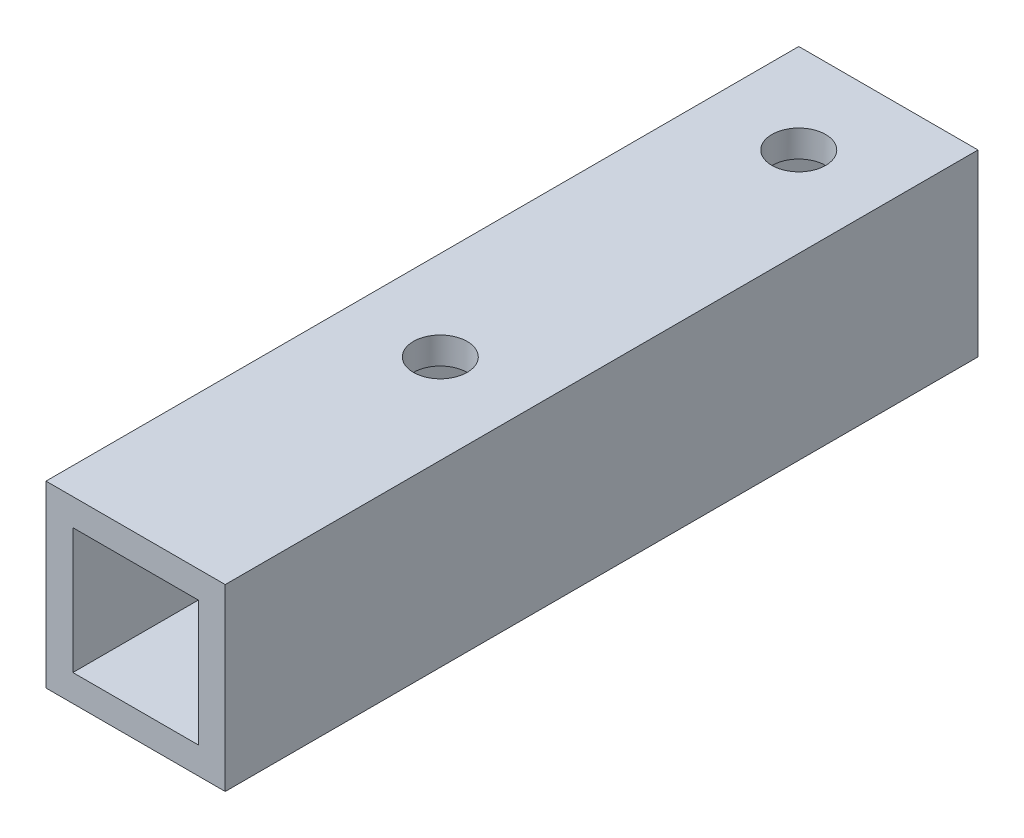
ISO-10303-21;
HEADER;
FILE_DESCRIPTION(('STEP AP214'),'2;1');
FILE_NAME('part.step','',(''),(''),'','','');
FILE_SCHEMA(('AUTOMOTIVE_DESIGN { 1 0 10303 214 1 1 1 1 }'));
ENDSEC;
DATA;
#1=APPLICATION_CONTEXT('core data for automotive mechanical design processes');
#2=APPLICATION_PROTOCOL_DEFINITION('international standard','automotive_design',2000,#1);
#3=PRODUCT_CONTEXT('',#1,'mechanical');
#4=PRODUCT('Part','Part','',(#3));
#5=PRODUCT_RELATED_PRODUCT_CATEGORY('part','',(#4));
#6=PRODUCT_DEFINITION_FORMATION('','',#4);
#7=PRODUCT_DEFINITION_CONTEXT('part definition',#1,'design');
#8=PRODUCT_DEFINITION('design','',#6,#7);
#9=PRODUCT_DEFINITION_SHAPE('','',#8);
#10=(LENGTH_UNIT() NAMED_UNIT(*) SI_UNIT(.MILLI.,.METRE.));
#11=(NAMED_UNIT(*) PLANE_ANGLE_UNIT() SI_UNIT($,.RADIAN.));
#12=(NAMED_UNIT(*) SI_UNIT($,.STERADIAN.) SOLID_ANGLE_UNIT());
#13=UNCERTAINTY_MEASURE_WITH_UNIT(LENGTH_MEASURE(1.E-05),#10,'distance_accuracy_value','');
#14=(GEOMETRIC_REPRESENTATION_CONTEXT(3) GLOBAL_UNCERTAINTY_ASSIGNED_CONTEXT((#13)) GLOBAL_UNIT_ASSIGNED_CONTEXT((#10,
#11,#12)) REPRESENTATION_CONTEXT('',''));
#15=CARTESIAN_POINT('',(0.,0.,0.));
#16=DIRECTION('',(0.,0.,1.));
#17=DIRECTION('',(1.,0.,0.));
#18=AXIS2_PLACEMENT_3D('',#15,#16,#17);
#19=CARTESIAN_POINT('',(0.,0.,42.));
#20=DIRECTION('',(0.,0.,1.));
#21=DIRECTION('',(1.,0.,0.));
#22=AXIS2_PLACEMENT_3D('',#19,#20,#21);
#23=PLANE('',#22);
#24=DIRECTION('',(0.,1.,0.));
#25=VECTOR('',#24,1.);
#26=CARTESIAN_POINT('',(5.,-5.,42.));
#27=LINE('',#26,#25);
#28=CARTESIAN_POINT('',(5.,-5.,42.));
#29=VERTEX_POINT('',#28);
#30=CARTESIAN_POINT('',(5.,5.,42.));
#31=VERTEX_POINT('',#30);
#32=EDGE_CURVE('E166',#29,#31,#27,.T.);
#33=ORIENTED_EDGE('',*,*,#32,.T.);
#34=DIRECTION('',(-1.,0.,0.));
#35=VECTOR('',#34,1.);
#36=CARTESIAN_POINT('',(-5.,5.,42.));
#37=LINE('',#36,#35);
#38=CARTESIAN_POINT('',(-5.,5.,42.));
#39=VERTEX_POINT('',#38);
#40=EDGE_CURVE('E169',#31,#39,#37,.T.);
#41=ORIENTED_EDGE('',*,*,#40,.T.);
#42=DIRECTION('',(0.,-1.,0.));
#43=VECTOR('',#42,1.);
#44=CARTESIAN_POINT('',(-5.,-5.,42.));
#45=LINE('',#44,#43);
#46=CARTESIAN_POINT('',(-5.,-5.,42.));
#47=VERTEX_POINT('',#46);
#48=EDGE_CURVE('E172',#39,#47,#45,.T.);
#49=ORIENTED_EDGE('',*,*,#48,.T.);
#50=DIRECTION('',(1.,0.,0.));
#51=VECTOR('',#50,1.);
#52=CARTESIAN_POINT('',(-5.,-5.,42.));
#53=LINE('',#52,#51);
#54=EDGE_CURVE('E174',#47,#29,#53,.T.);
#55=ORIENTED_EDGE('',*,*,#54,.T.);
#56=EDGE_LOOP('',(#33,#41,#49,#55));
#57=FACE_BOUND('',#56,.T.);
#58=DIRECTION('',(-1.,0.,0.));
#59=VECTOR('',#58,1.);
#60=CARTESIAN_POINT('',(0.,3.5,42.));
#61=LINE('',#60,#59);
#62=CARTESIAN_POINT('',(3.5,3.5,42.));
#63=VERTEX_POINT('',#62);
#64=CARTESIAN_POINT('',(-3.5,3.5,42.));
#65=VERTEX_POINT('',#64);
#66=EDGE_CURVE('E136',#63,#65,#61,.T.);
#67=ORIENTED_EDGE('',*,*,#66,.F.);
#68=DIRECTION('',(0.,1.,0.));
#69=VECTOR('',#68,1.);
#70=CARTESIAN_POINT('',(3.5,0.,42.));
#71=LINE('',#70,#69);
#72=CARTESIAN_POINT('',(3.5,-3.5,42.));
#73=VERTEX_POINT('',#72);
#74=EDGE_CURVE('E128',#73,#63,#71,.T.);
#75=ORIENTED_EDGE('',*,*,#74,.F.);
#76=DIRECTION('',(1.,0.,0.));
#77=VECTOR('',#76,1.);
#78=CARTESIAN_POINT('',(0.,-3.5,42.));
#79=LINE('',#78,#77);
#80=CARTESIAN_POINT('',(-3.5,-3.5,42.));
#81=VERTEX_POINT('',#80);
#82=EDGE_CURVE('E150',#81,#73,#79,.T.);
#83=ORIENTED_EDGE('',*,*,#82,.F.);
#84=DIRECTION('',(0.,-1.,0.));
#85=VECTOR('',#84,1.);
#86=CARTESIAN_POINT('',(-3.5,0.,42.));
#87=LINE('',#86,#85);
#88=EDGE_CURVE('E148',#65,#81,#87,.T.);
#89=ORIENTED_EDGE('',*,*,#88,.F.);
#90=EDGE_LOOP('',(#67,#75,#83,#89));
#91=FACE_BOUND('',#90,.T.);
#92=ADVANCED_FACE('F61',(#57,#91),#23,.T.);
#93=CARTESIAN_POINT('',(0.,0.,0.));
#94=DIRECTION('',(0.,0.,1.));
#95=DIRECTION('',(1.,0.,0.));
#96=AXIS2_PLACEMENT_3D('',#93,#94,#95);
#97=PLANE('',#96);
#98=DIRECTION('',(0.,1.,0.));
#99=VECTOR('',#98,1.);
#100=CARTESIAN_POINT('',(5.,-5.,0.));
#101=LINE('',#100,#99);
#102=CARTESIAN_POINT('',(5.,-5.,0.));
#103=VERTEX_POINT('',#102);
#104=CARTESIAN_POINT('',(5.,5.,0.));
#105=VERTEX_POINT('',#104);
#106=EDGE_CURVE('E144',#103,#105,#101,.T.);
#107=ORIENTED_EDGE('',*,*,#106,.F.);
#108=DIRECTION('',(1.,0.,0.));
#109=VECTOR('',#108,1.);
#110=CARTESIAN_POINT('',(-5.,-5.,0.));
#111=LINE('',#110,#109);
#112=CARTESIAN_POINT('',(-5.,-5.,0.));
#113=VERTEX_POINT('',#112);
#114=EDGE_CURVE('E170',#113,#103,#111,.T.);
#115=ORIENTED_EDGE('',*,*,#114,.F.);
#116=DIRECTION('',(0.,-1.,0.));
#117=VECTOR('',#116,1.);
#118=CARTESIAN_POINT('',(-5.,-5.,0.));
#119=LINE('',#118,#117);
#120=CARTESIAN_POINT('',(-5.,5.,0.));
#121=VERTEX_POINT('',#120);
#122=EDGE_CURVE('E181',#121,#113,#119,.T.);
#123=ORIENTED_EDGE('',*,*,#122,.F.);
#124=DIRECTION('',(-1.,0.,0.));
#125=VECTOR('',#124,1.);
#126=CARTESIAN_POINT('',(-5.,5.,0.));
#127=LINE('',#126,#125);
#128=EDGE_CURVE('E179',#105,#121,#127,.T.);
#129=ORIENTED_EDGE('',*,*,#128,.F.);
#130=EDGE_LOOP('',(#107,#115,#123,#129));
#131=FACE_BOUND('',#130,.T.);
#132=DIRECTION('',(0.,1.,0.));
#133=VECTOR('',#132,1.);
#134=CARTESIAN_POINT('',(3.5,0.,0.));
#135=LINE('',#134,#133);
#136=CARTESIAN_POINT('',(3.5,-3.5,0.));
#137=VERTEX_POINT('',#136);
#138=CARTESIAN_POINT('',(3.5,3.5,0.));
#139=VERTEX_POINT('',#138);
#140=EDGE_CURVE('E86',#137,#139,#135,.T.);
#141=ORIENTED_EDGE('',*,*,#140,.T.);
#142=DIRECTION('',(-1.,0.,0.));
#143=VECTOR('',#142,1.);
#144=CARTESIAN_POINT('',(0.,3.5,0.));
#145=LINE('',#144,#143);
#146=CARTESIAN_POINT('',(-3.5,3.5,0.));
#147=VERTEX_POINT('',#146);
#148=EDGE_CURVE('E143',#139,#147,#145,.T.);
#149=ORIENTED_EDGE('',*,*,#148,.T.);
#150=DIRECTION('',(0.,-1.,0.));
#151=VECTOR('',#150,1.);
#152=CARTESIAN_POINT('',(-3.5,0.,0.));
#153=LINE('',#152,#151);
#154=CARTESIAN_POINT('',(-3.5,-3.5,0.));
#155=VERTEX_POINT('',#154);
#156=EDGE_CURVE('E158',#147,#155,#153,.T.);
#157=ORIENTED_EDGE('',*,*,#156,.T.);
#158=DIRECTION('',(1.,0.,0.));
#159=VECTOR('',#158,1.);
#160=CARTESIAN_POINT('',(0.,-3.5,0.));
#161=LINE('',#160,#159);
#162=EDGE_CURVE('E137',#155,#137,#161,.T.);
#163=ORIENTED_EDGE('',*,*,#162,.T.);
#164=EDGE_LOOP('',(#141,#149,#157,#163));
#165=FACE_BOUND('',#164,.T.);
#166=ADVANCED_FACE('F228',(#131,#165),#97,.F.);
#167=CARTESIAN_POINT('',(5.,-5.,42.));
#168=DIRECTION('',(-1.,0.,0.));
#169=DIRECTION('',(0.,0.,1.));
#170=AXIS2_PLACEMENT_3D('',#167,#168,#169);
#171=PLANE('',#170);
#172=ORIENTED_EDGE('',*,*,#106,.T.);
#173=DIRECTION('',(0.,0.,-1.));
#174=VECTOR('',#173,1.);
#175=CARTESIAN_POINT('',(5.,5.,42.));
#176=LINE('',#175,#174);
#177=EDGE_CURVE('E12',#31,#105,#176,.T.);
#178=ORIENTED_EDGE('',*,*,#177,.F.);
#179=ORIENTED_EDGE('',*,*,#32,.F.);
#180=DIRECTION('',(0.,0.,-1.));
#181=VECTOR('',#180,1.);
#182=CARTESIAN_POINT('',(5.,-5.,42.));
#183=LINE('',#182,#181);
#184=EDGE_CURVE('E176',#29,#103,#183,.T.);
#185=ORIENTED_EDGE('',*,*,#184,.T.);
#186=EDGE_LOOP('',(#172,#178,#179,#185));
#187=FACE_BOUND('',#186,.T.);
#188=ADVANCED_FACE('F63',(#187),#171,.F.);
#189=CARTESIAN_POINT('',(-5.,5.,42.));
#190=DIRECTION('',(0.,-1.,0.));
#191=DIRECTION('',(0.,0.,-1.));
#192=AXIS2_PLACEMENT_3D('',#189,#190,#191);
#193=PLANE('',#192);
#194=CARTESIAN_POINT('',(0.,5.,5.));
#195=DIRECTION('',(0.,1.,0.));
#196=DIRECTION('',(0.,0.,1.));
#197=AXIS2_PLACEMENT_3D('',#194,#195,#196);
#198=CIRCLE('',#197,1.5);
#199=CARTESIAN_POINT('',(0.,5.,6.5));
#200=VERTEX_POINT('',#199);
#201=EDGE_CURVE('E199',#200,#200,#198,.T.);
#202=ORIENTED_EDGE('',*,*,#201,.F.);
#203=EDGE_LOOP('',(#202));
#204=FACE_BOUND('',#203,.T.);
#205=CARTESIAN_POINT('',(0.,5.,25.));
#206=DIRECTION('',(0.,1.,0.));
#207=DIRECTION('',(0.,0.,1.));
#208=AXIS2_PLACEMENT_3D('',#205,#206,#207);
#209=CIRCLE('',#208,1.5);
#210=CARTESIAN_POINT('',(0.,5.,26.5));
#211=VERTEX_POINT('',#210);
#212=EDGE_CURVE('E209',#211,#211,#209,.T.);
#213=ORIENTED_EDGE('',*,*,#212,.F.);
#214=EDGE_LOOP('',(#213));
#215=FACE_BOUND('',#214,.T.);
#216=ORIENTED_EDGE('',*,*,#128,.T.);
#217=DIRECTION('',(0.,0.,-1.));
#218=VECTOR('',#217,1.);
#219=CARTESIAN_POINT('',(-5.,5.,42.));
#220=LINE('',#219,#218);
#221=EDGE_CURVE('E70',#39,#121,#220,.T.);
#222=ORIENTED_EDGE('',*,*,#221,.F.);
#223=ORIENTED_EDGE('',*,*,#40,.F.);
#224=ORIENTED_EDGE('',*,*,#177,.T.);
#225=EDGE_LOOP('',(#216,#222,#223,#224));
#226=FACE_BOUND('',#225,.T.);
#227=ADVANCED_FACE('F252',(#204,#215,#226),#193,.F.);
#228=CARTESIAN_POINT('',(-5.,-5.,42.));
#229=DIRECTION('',(1.,0.,0.));
#230=DIRECTION('',(0.,0.,-1.));
#231=AXIS2_PLACEMENT_3D('',#228,#229,#230);
#232=PLANE('',#231);
#233=ORIENTED_EDGE('',*,*,#122,.T.);
#234=DIRECTION('',(0.,0.,-1.));
#235=VECTOR('',#234,1.);
#236=CARTESIAN_POINT('',(-5.,-5.,42.));
#237=LINE('',#236,#235);
#238=EDGE_CURVE('E186',#47,#113,#237,.T.);
#239=ORIENTED_EDGE('',*,*,#238,.F.);
#240=ORIENTED_EDGE('',*,*,#48,.F.);
#241=ORIENTED_EDGE('',*,*,#221,.T.);
#242=EDGE_LOOP('',(#233,#239,#240,#241));
#243=FACE_BOUND('',#242,.T.);
#244=ADVANCED_FACE('F250',(#243),#232,.F.);
#245=CARTESIAN_POINT('',(-5.,-5.,42.));
#246=DIRECTION('',(0.,1.,0.));
#247=DIRECTION('',(0.,0.,1.));
#248=AXIS2_PLACEMENT_3D('',#245,#246,#247);
#249=PLANE('',#248);
#250=CARTESIAN_POINT('',(0.,-5.,5.));
#251=DIRECTION('',(0.,1.,0.));
#252=DIRECTION('',(0.,0.,1.));
#253=AXIS2_PLACEMENT_3D('',#250,#251,#252);
#254=CIRCLE('',#253,1.5);
#255=CARTESIAN_POINT('',(0.,-5.,6.5));
#256=VERTEX_POINT('',#255);
#257=EDGE_CURVE('E193',#256,#256,#254,.T.);
#258=ORIENTED_EDGE('',*,*,#257,.T.);
#259=EDGE_LOOP('',(#258));
#260=FACE_BOUND('',#259,.T.);
#261=CARTESIAN_POINT('',(0.,-5.,25.));
#262=DIRECTION('',(0.,1.,0.));
#263=DIRECTION('',(0.,0.,1.));
#264=AXIS2_PLACEMENT_3D('',#261,#262,#263);
#265=CIRCLE('',#264,1.5);
#266=CARTESIAN_POINT('',(0.,-5.,26.5));
#267=VERTEX_POINT('',#266);
#268=EDGE_CURVE('E204',#267,#267,#265,.T.);
#269=ORIENTED_EDGE('',*,*,#268,.T.);
#270=EDGE_LOOP('',(#269));
#271=FACE_BOUND('',#270,.T.);
#272=ORIENTED_EDGE('',*,*,#114,.T.);
#273=ORIENTED_EDGE('',*,*,#184,.F.);
#274=ORIENTED_EDGE('',*,*,#54,.F.);
#275=ORIENTED_EDGE('',*,*,#238,.T.);
#276=EDGE_LOOP('',(#272,#273,#274,#275));
#277=FACE_BOUND('',#276,.T.);
#278=ADVANCED_FACE('F247',(#260,#271,#277),#249,.F.);
#279=CARTESIAN_POINT('',(3.5,0.,42.));
#280=DIRECTION('',(-1.,0.,0.));
#281=DIRECTION('',(0.,0.,1.));
#282=AXIS2_PLACEMENT_3D('',#279,#280,#281);
#283=PLANE('',#282);
#284=ORIENTED_EDGE('',*,*,#140,.F.);
#285=DIRECTION('',(0.,0.,-1.));
#286=VECTOR('',#285,1.);
#287=CARTESIAN_POINT('',(3.5,-3.5,42.));
#288=LINE('',#287,#286);
#289=EDGE_CURVE('E132',#73,#137,#288,.T.);
#290=ORIENTED_EDGE('',*,*,#289,.F.);
#291=ORIENTED_EDGE('',*,*,#74,.T.);
#292=DIRECTION('',(0.,0.,-1.));
#293=VECTOR('',#292,1.);
#294=CARTESIAN_POINT('',(3.5,3.5,42.));
#295=LINE('',#294,#293);
#296=EDGE_CURVE('E131',#63,#139,#295,.T.);
#297=ORIENTED_EDGE('',*,*,#296,.T.);
#298=EDGE_LOOP('',(#284,#290,#291,#297));
#299=FACE_BOUND('',#298,.T.);
#300=ADVANCED_FACE('F130',(#299),#283,.T.);
#301=CARTESIAN_POINT('',(0.,3.5,42.));
#302=DIRECTION('',(0.,-1.,0.));
#303=DIRECTION('',(0.,0.,-1.));
#304=AXIS2_PLACEMENT_3D('',#301,#302,#303);
#305=PLANE('',#304);
#306=CARTESIAN_POINT('',(0.,3.5,5.));
#307=DIRECTION('',(0.,-1.,0.));
#308=DIRECTION('',(0.,0.,-1.));
#309=AXIS2_PLACEMENT_3D('',#306,#307,#308);
#310=CIRCLE('',#309,1.5);
#311=CARTESIAN_POINT('',(0.,3.5,3.5));
#312=VERTEX_POINT('',#311);
#313=EDGE_CURVE('E156',#312,#312,#310,.T.);
#314=ORIENTED_EDGE('',*,*,#313,.F.);
#315=EDGE_LOOP('',(#314));
#316=FACE_BOUND('',#315,.T.);
#317=CARTESIAN_POINT('',(0.,3.5,25.));
#318=DIRECTION('',(0.,-1.,0.));
#319=DIRECTION('',(0.,0.,-1.));
#320=AXIS2_PLACEMENT_3D('',#317,#318,#319);
#321=CIRCLE('',#320,1.5);
#322=CARTESIAN_POINT('',(0.,3.5,23.5));
#323=VERTEX_POINT('',#322);
#324=EDGE_CURVE('E192',#323,#323,#321,.T.);
#325=ORIENTED_EDGE('',*,*,#324,.F.);
#326=EDGE_LOOP('',(#325));
#327=FACE_BOUND('',#326,.T.);
#328=ORIENTED_EDGE('',*,*,#148,.F.);
#329=ORIENTED_EDGE('',*,*,#296,.F.);
#330=ORIENTED_EDGE('',*,*,#66,.T.);
#331=DIRECTION('',(0.,0.,-1.));
#332=VECTOR('',#331,1.);
#333=CARTESIAN_POINT('',(-3.5,3.5,42.));
#334=LINE('',#333,#332);
#335=EDGE_CURVE('E145',#65,#147,#334,.T.);
#336=ORIENTED_EDGE('',*,*,#335,.T.);
#337=EDGE_LOOP('',(#328,#329,#330,#336));
#338=FACE_BOUND('',#337,.T.);
#339=ADVANCED_FACE('F140',(#316,#327,#338),#305,.T.);
#340=CARTESIAN_POINT('',(-3.5,0.,42.));
#341=DIRECTION('',(1.,0.,0.));
#342=DIRECTION('',(0.,0.,-1.));
#343=AXIS2_PLACEMENT_3D('',#340,#341,#342);
#344=PLANE('',#343);
#345=ORIENTED_EDGE('',*,*,#156,.F.);
#346=ORIENTED_EDGE('',*,*,#335,.F.);
#347=ORIENTED_EDGE('',*,*,#88,.T.);
#348=DIRECTION('',(0.,0.,-1.));
#349=VECTOR('',#348,1.);
#350=CARTESIAN_POINT('',(-3.5,-3.5,42.));
#351=LINE('',#350,#349);
#352=EDGE_CURVE('E78',#81,#155,#351,.T.);
#353=ORIENTED_EDGE('',*,*,#352,.T.);
#354=EDGE_LOOP('',(#345,#346,#347,#353));
#355=FACE_BOUND('',#354,.T.);
#356=ADVANCED_FACE('F224',(#355),#344,.T.);
#357=CARTESIAN_POINT('',(0.,-3.5,42.));
#358=DIRECTION('',(0.,1.,0.));
#359=DIRECTION('',(0.,0.,1.));
#360=AXIS2_PLACEMENT_3D('',#357,#358,#359);
#361=PLANE('',#360);
#362=CARTESIAN_POINT('',(0.,-3.5,5.));
#363=DIRECTION('',(0.,1.,0.));
#364=DIRECTION('',(0.,0.,1.));
#365=AXIS2_PLACEMENT_3D('',#362,#363,#364);
#366=CIRCLE('',#365,1.5);
#367=CARTESIAN_POINT('',(0.,-3.5,6.5));
#368=VERTEX_POINT('',#367);
#369=EDGE_CURVE('E65',#368,#368,#366,.T.);
#370=ORIENTED_EDGE('',*,*,#369,.F.);
#371=EDGE_LOOP('',(#370));
#372=FACE_BOUND('',#371,.T.);
#373=CARTESIAN_POINT('',(0.,-3.5,25.));
#374=DIRECTION('',(0.,1.,0.));
#375=DIRECTION('',(0.,0.,1.));
#376=AXIS2_PLACEMENT_3D('',#373,#374,#375);
#377=CIRCLE('',#376,1.5);
#378=CARTESIAN_POINT('',(0.,-3.5,26.5));
#379=VERTEX_POINT('',#378);
#380=EDGE_CURVE('E190',#379,#379,#377,.T.);
#381=ORIENTED_EDGE('',*,*,#380,.F.);
#382=EDGE_LOOP('',(#381));
#383=FACE_BOUND('',#382,.T.);
#384=ORIENTED_EDGE('',*,*,#162,.F.);
#385=ORIENTED_EDGE('',*,*,#352,.F.);
#386=ORIENTED_EDGE('',*,*,#82,.T.);
#387=ORIENTED_EDGE('',*,*,#289,.T.);
#388=EDGE_LOOP('',(#384,#385,#386,#387));
#389=FACE_BOUND('',#388,.T.);
#390=ADVANCED_FACE('F220',(#372,#383,#389),#361,.T.);
#391=CARTESIAN_POINT('',(0.,-5.,25.));
#392=DIRECTION('',(0.,1.,0.));
#393=DIRECTION('',(0.,0.,1.));
#394=AXIS2_PLACEMENT_3D('',#391,#392,#393);
#395=CYLINDRICAL_SURFACE('',#394,1.5);
#396=ORIENTED_EDGE('',*,*,#380,.T.);
#397=EDGE_LOOP('',(#396));
#398=FACE_BOUND('',#397,.T.);
#399=ORIENTED_EDGE('',*,*,#268,.F.);
#400=EDGE_LOOP('',(#399));
#401=FACE_BOUND('',#400,.T.);
#402=ADVANCED_FACE('F223',(#398,#401),#395,.F.);
#403=CARTESIAN_POINT('',(0.,-5.,5.));
#404=DIRECTION('',(0.,1.,0.));
#405=DIRECTION('',(0.,0.,1.));
#406=AXIS2_PLACEMENT_3D('',#403,#404,#405);
#407=CYLINDRICAL_SURFACE('',#406,1.5);
#408=ORIENTED_EDGE('',*,*,#369,.T.);
#409=EDGE_LOOP('',(#408));
#410=FACE_BOUND('',#409,.T.);
#411=ORIENTED_EDGE('',*,*,#257,.F.);
#412=EDGE_LOOP('',(#411));
#413=FACE_BOUND('',#412,.T.);
#414=ADVANCED_FACE('F217',(#410,#413),#407,.F.);
#415=ORIENTED_EDGE('',*,*,#324,.T.);
#416=EDGE_LOOP('',(#415));
#417=FACE_BOUND('',#416,.T.);
#418=ORIENTED_EDGE('',*,*,#212,.T.);
#419=EDGE_LOOP('',(#418));
#420=FACE_BOUND('',#419,.T.);
#421=ADVANCED_FACE('F276',(#417,#420),#395,.F.);
#422=ORIENTED_EDGE('',*,*,#313,.T.);
#423=EDGE_LOOP('',(#422));
#424=FACE_BOUND('',#423,.T.);
#425=ORIENTED_EDGE('',*,*,#201,.T.);
#426=EDGE_LOOP('',(#425));
#427=FACE_BOUND('',#426,.T.);
#428=ADVANCED_FACE('F278',(#424,#427),#407,.F.);
#429=CLOSED_SHELL('',(#92,#166,#188,#227,#244,#278,#300,#339,#356,#390,#402,#414,#421,#428));
#430=MANIFOLD_SOLID_BREP('B2',#429);
#431=ADVANCED_BREP_SHAPE_REPRESENTATION('',(#18,#430),#14);
#432=SHAPE_DEFINITION_REPRESENTATION(#9,#431);
ENDSEC;
END-ISO-10303-21;
